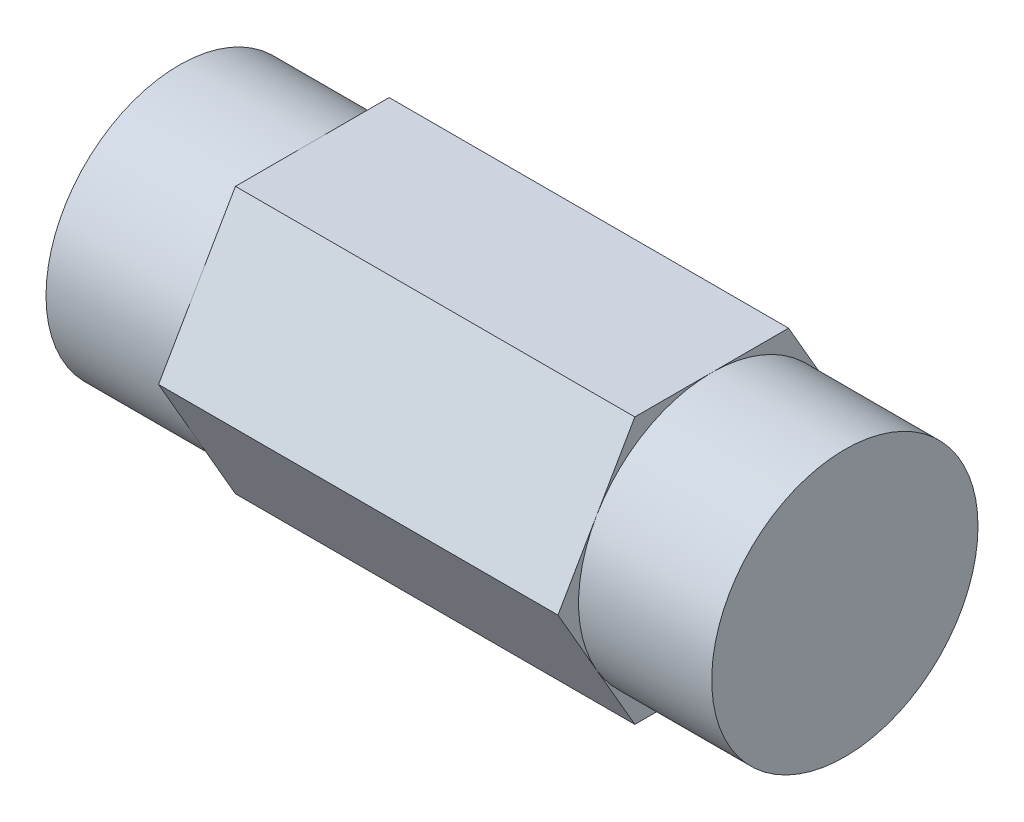
ISO-10303-21;
HEADER;
FILE_DESCRIPTION(('STEP AP214'),'2;1');
FILE_NAME('part.step','',(''),(''),'','','');
FILE_SCHEMA(('AUTOMOTIVE_DESIGN { 1 0 10303 214 1 1 1 1 }'));
ENDSEC;
DATA;
#1=APPLICATION_CONTEXT('core data for automotive mechanical design processes');
#2=APPLICATION_PROTOCOL_DEFINITION('international standard','automotive_design',2000,#1);
#3=PRODUCT_CONTEXT('',#1,'mechanical');
#4=PRODUCT('Part','Part','',(#3));
#5=PRODUCT_RELATED_PRODUCT_CATEGORY('part','',(#4));
#6=PRODUCT_DEFINITION_FORMATION('','',#4);
#7=PRODUCT_DEFINITION_CONTEXT('part definition',#1,'design');
#8=PRODUCT_DEFINITION('design','',#6,#7);
#9=PRODUCT_DEFINITION_SHAPE('','',#8);
#10=(LENGTH_UNIT() NAMED_UNIT(*) SI_UNIT(.MILLI.,.METRE.));
#11=(NAMED_UNIT(*) PLANE_ANGLE_UNIT() SI_UNIT($,.RADIAN.));
#12=(NAMED_UNIT(*) SI_UNIT($,.STERADIAN.) SOLID_ANGLE_UNIT());
#13=UNCERTAINTY_MEASURE_WITH_UNIT(LENGTH_MEASURE(1.E-05),#10,'distance_accuracy_value','');
#14=(GEOMETRIC_REPRESENTATION_CONTEXT(3) GLOBAL_UNCERTAINTY_ASSIGNED_CONTEXT((#13)) GLOBAL_UNIT_ASSIGNED_CONTEXT((#10,
#11,#12)) REPRESENTATION_CONTEXT('',''));
#15=CARTESIAN_POINT('',(0.,0.,0.));
#16=DIRECTION('',(0.,0.,1.));
#17=DIRECTION('',(1.,0.,0.));
#18=AXIS2_PLACEMENT_3D('',#15,#16,#17);
#19=CARTESIAN_POINT('',(0.,0.,0.));
#20=DIRECTION('',(1.,0.,0.));
#21=DIRECTION('',(0.,0.,-1.));
#22=AXIS2_PLACEMENT_3D('',#19,#20,#21);
#23=PLANE('',#22);
#24=CARTESIAN_POINT('',(0.,0.,0.));
#25=DIRECTION('',(-1.,0.,0.));
#26=DIRECTION('',(0.,0.,1.));
#27=AXIS2_PLACEMENT_3D('',#24,#25,#26);
#28=CIRCLE('',#27,6.35);
#29=CARTESIAN_POINT('',(0.,3.175,5.49926131403119));
#30=VERTEX_POINT('',#29);
#31=CARTESIAN_POINT('',(0.,6.35,0.));
#32=VERTEX_POINT('',#31);
#33=EDGE_CURVE('E46',#30,#32,#28,.T.);
#34=ORIENTED_EDGE('',*,*,#33,.F.);
#35=DIRECTION('',(0.,-0.866025403784439,0.5));
#36=VECTOR('',#35,1.);
#37=CARTESIAN_POINT('',(0.,6.35,3.66617420935412));
#38=LINE('',#37,#36);
#39=CARTESIAN_POINT('',(0.,6.35,3.66617420935412));
#40=VERTEX_POINT('',#39);
#41=EDGE_CURVE('E130',#40,#30,#38,.T.);
#42=ORIENTED_EDGE('',*,*,#41,.F.);
#43=DIRECTION('',(0.,0.,1.));
#44=VECTOR('',#43,1.);
#45=CARTESIAN_POINT('',(0.,6.35,-3.66617420935412));
#46=LINE('',#45,#44);
#47=EDGE_CURVE('E153',#32,#40,#46,.T.);
#48=ORIENTED_EDGE('',*,*,#47,.F.);
#49=EDGE_LOOP('',(#34,#42,#48));
#50=FACE_BOUND('',#49,.T.);
#51=ADVANCED_FACE('F35',(#50),#23,.F.);
#52=CARTESIAN_POINT('',(0.,3.175,-5.49926131403118));
#53=VERTEX_POINT('',#52);
#54=EDGE_CURVE('E11',#32,#53,#28,.T.);
#55=ORIENTED_EDGE('',*,*,#54,.F.);
#56=CARTESIAN_POINT('',(0.,6.35,-3.66617420935412));
#57=VERTEX_POINT('',#56);
#58=EDGE_CURVE('E151',#57,#32,#46,.T.);
#59=ORIENTED_EDGE('',*,*,#58,.F.);
#60=DIRECTION('',(0.,0.866025403784439,0.5));
#61=VECTOR('',#60,1.);
#62=CARTESIAN_POINT('',(0.,0.,-7.33234841870824));
#63=LINE('',#62,#61);
#64=EDGE_CURVE('E203',#53,#57,#63,.T.);
#65=ORIENTED_EDGE('',*,*,#64,.F.);
#66=EDGE_LOOP('',(#55,#59,#65));
#67=FACE_BOUND('',#66,.T.);
#68=ADVANCED_FACE('F246',(#67),#23,.F.);
#69=CARTESIAN_POINT('',(0.,-3.175,-5.49926131403118));
#70=VERTEX_POINT('',#69);
#71=EDGE_CURVE('E44',#53,#70,#28,.T.);
#72=ORIENTED_EDGE('',*,*,#71,.F.);
#73=CARTESIAN_POINT('',(0.,0.,-7.33234841870824));
#74=VERTEX_POINT('',#73);
#75=EDGE_CURVE('E204',#74,#53,#63,.T.);
#76=ORIENTED_EDGE('',*,*,#75,.F.);
#77=DIRECTION('',(0.,0.866025403784439,-0.5));
#78=VECTOR('',#77,1.);
#79=CARTESIAN_POINT('',(0.,-6.35,-3.66617420935412));
#80=LINE('',#79,#78);
#81=EDGE_CURVE('E199',#70,#74,#80,.T.);
#82=ORIENTED_EDGE('',*,*,#81,.F.);
#83=EDGE_LOOP('',(#72,#76,#82));
#84=FACE_BOUND('',#83,.T.);
#85=ADVANCED_FACE('F250',(#84),#23,.F.);
#86=CARTESIAN_POINT('',(0.,-6.35,0.));
#87=VERTEX_POINT('',#86);
#88=EDGE_CURVE('E60',#70,#87,#28,.T.);
#89=ORIENTED_EDGE('',*,*,#88,.F.);
#90=CARTESIAN_POINT('',(0.,-6.35,-3.66617420935412));
#91=VERTEX_POINT('',#90);
#92=EDGE_CURVE('E200',#91,#70,#80,.T.);
#93=ORIENTED_EDGE('',*,*,#92,.F.);
#94=DIRECTION('',(0.,0.,-1.));
#95=VECTOR('',#94,1.);
#96=CARTESIAN_POINT('',(0.,-6.35,3.66617420935412));
#97=LINE('',#96,#95);
#98=EDGE_CURVE('E195',#87,#91,#97,.T.);
#99=ORIENTED_EDGE('',*,*,#98,.F.);
#100=EDGE_LOOP('',(#89,#93,#99));
#101=FACE_BOUND('',#100,.T.);
#102=ADVANCED_FACE('F253',(#101),#23,.F.);
#103=CARTESIAN_POINT('',(0.,-3.175,5.49926131403118));
#104=VERTEX_POINT('',#103);
#105=EDGE_CURVE('E53',#87,#104,#28,.T.);
#106=ORIENTED_EDGE('',*,*,#105,.F.);
#107=CARTESIAN_POINT('',(0.,-6.35,3.66617420935412));
#108=VERTEX_POINT('',#107);
#109=EDGE_CURVE('E196',#108,#87,#97,.T.);
#110=ORIENTED_EDGE('',*,*,#109,.F.);
#111=DIRECTION('',(0.,-0.866025403784439,-0.5));
#112=VECTOR('',#111,1.);
#113=CARTESIAN_POINT('',(0.,0.,7.33234841870824));
#114=LINE('',#113,#112);
#115=EDGE_CURVE('E167',#104,#108,#114,.T.);
#116=ORIENTED_EDGE('',*,*,#115,.F.);
#117=EDGE_LOOP('',(#106,#110,#116));
#118=FACE_BOUND('',#117,.T.);
#119=ADVANCED_FACE('F255',(#118),#23,.F.);
#120=CARTESIAN_POINT('',(19.05,0.,0.));
#121=DIRECTION('',(1.,0.,0.));
#122=DIRECTION('',(0.,0.,-1.));
#123=AXIS2_PLACEMENT_3D('',#120,#121,#122);
#124=PLANE('',#123);
#125=CARTESIAN_POINT('',(19.05,0.,0.));
#126=DIRECTION('',(1.,0.,0.));
#127=DIRECTION('',(0.,0.,-1.));
#128=AXIS2_PLACEMENT_3D('',#125,#126,#127);
#129=CIRCLE('',#128,6.35);
#130=CARTESIAN_POINT('',(19.05,3.175,-5.49926131403118));
#131=VERTEX_POINT('',#130);
#132=CARTESIAN_POINT('',(19.05,6.35,0.));
#133=VERTEX_POINT('',#132);
#134=EDGE_CURVE('E162',#131,#133,#129,.T.);
#135=ORIENTED_EDGE('',*,*,#134,.F.);
#136=DIRECTION('',(0.,0.866025403784439,0.5));
#137=VECTOR('',#136,1.);
#138=CARTESIAN_POINT('',(19.05,0.,-7.33234841870824));
#139=LINE('',#138,#137);
#140=CARTESIAN_POINT('',(19.05,6.35,-3.66617420935412));
#141=VERTEX_POINT('',#140);
#142=EDGE_CURVE('E182',#131,#141,#139,.T.);
#143=ORIENTED_EDGE('',*,*,#142,.T.);
#144=DIRECTION('',(0.,0.,1.));
#145=VECTOR('',#144,1.);
#146=CARTESIAN_POINT('',(19.05,6.35,-3.66617420935412));
#147=LINE('',#146,#145);
#148=EDGE_CURVE('E186',#141,#133,#147,.T.);
#149=ORIENTED_EDGE('',*,*,#148,.T.);
#150=EDGE_LOOP('',(#135,#143,#149));
#151=FACE_BOUND('',#150,.T.);
#152=ADVANCED_FACE('F272',(#151),#124,.T.);
#153=CARTESIAN_POINT('',(19.05,3.175,5.49926131403119));
#154=VERTEX_POINT('',#153);
#155=EDGE_CURVE('E158',#133,#154,#129,.T.);
#156=ORIENTED_EDGE('',*,*,#155,.F.);
#157=CARTESIAN_POINT('',(19.05,6.35,3.66617420935412));
#158=VERTEX_POINT('',#157);
#159=EDGE_CURVE('E185',#133,#158,#147,.T.);
#160=ORIENTED_EDGE('',*,*,#159,.T.);
#161=DIRECTION('',(0.,-0.866025403784439,0.5));
#162=VECTOR('',#161,1.);
#163=CARTESIAN_POINT('',(19.05,6.35,3.66617420935412));
#164=LINE('',#163,#162);
#165=EDGE_CURVE('E190',#158,#154,#164,.T.);
#166=ORIENTED_EDGE('',*,*,#165,.T.);
#167=EDGE_LOOP('',(#156,#160,#166));
#168=FACE_BOUND('',#167,.T.);
#169=ADVANCED_FACE('F237',(#168),#124,.T.);
#170=CARTESIAN_POINT('',(19.05,-3.175,5.49926131403118));
#171=VERTEX_POINT('',#170);
#172=EDGE_CURVE('E160',#154,#171,#129,.T.);
#173=ORIENTED_EDGE('',*,*,#172,.F.);
#174=CARTESIAN_POINT('',(19.05,0.,7.33234841870824));
#175=VERTEX_POINT('',#174);
#176=EDGE_CURVE('E189',#154,#175,#164,.T.);
#177=ORIENTED_EDGE('',*,*,#176,.T.);
#178=DIRECTION('',(0.,-0.866025403784439,-0.5));
#179=VECTOR('',#178,1.);
#180=CARTESIAN_POINT('',(19.05,0.,7.33234841870824));
#181=LINE('',#180,#179);
#182=EDGE_CURVE('E171',#175,#171,#181,.T.);
#183=ORIENTED_EDGE('',*,*,#182,.T.);
#184=EDGE_LOOP('',(#173,#177,#183));
#185=FACE_BOUND('',#184,.T.);
#186=ADVANCED_FACE('F234',(#185),#124,.T.);
#187=CARTESIAN_POINT('',(19.05,-6.35,0.));
#188=VERTEX_POINT('',#187);
#189=EDGE_CURVE('E228',#171,#188,#129,.T.);
#190=ORIENTED_EDGE('',*,*,#189,.F.);
#191=CARTESIAN_POINT('',(19.05,-6.35,3.66617420935412));
#192=VERTEX_POINT('',#191);
#193=EDGE_CURVE('E142',#171,#192,#181,.T.);
#194=ORIENTED_EDGE('',*,*,#193,.T.);
#195=DIRECTION('',(0.,0.,-1.));
#196=VECTOR('',#195,1.);
#197=CARTESIAN_POINT('',(19.05,-6.35,3.66617420935412));
#198=LINE('',#197,#196);
#199=EDGE_CURVE('E175',#192,#188,#198,.T.);
#200=ORIENTED_EDGE('',*,*,#199,.T.);
#201=EDGE_LOOP('',(#190,#194,#200));
#202=FACE_BOUND('',#201,.T.);
#203=ADVANCED_FACE('F259',(#202),#124,.T.);
#204=CARTESIAN_POINT('',(19.05,-3.175,-5.49926131403118));
#205=VERTEX_POINT('',#204);
#206=EDGE_CURVE('E225',#188,#205,#129,.T.);
#207=ORIENTED_EDGE('',*,*,#206,.F.);
#208=CARTESIAN_POINT('',(19.05,-6.35,-3.66617420935412));
#209=VERTEX_POINT('',#208);
#210=EDGE_CURVE('E174',#188,#209,#198,.T.);
#211=ORIENTED_EDGE('',*,*,#210,.T.);
#212=DIRECTION('',(0.,0.866025403784439,-0.5));
#213=VECTOR('',#212,1.);
#214=CARTESIAN_POINT('',(19.05,-6.35,-3.66617420935412));
#215=LINE('',#214,#213);
#216=EDGE_CURVE('E179',#209,#205,#215,.T.);
#217=ORIENTED_EDGE('',*,*,#216,.T.);
#218=EDGE_LOOP('',(#207,#211,#217));
#219=FACE_BOUND('',#218,.T.);
#220=ADVANCED_FACE('F262',(#219),#124,.T.);
#221=CARTESIAN_POINT('',(19.05,0.,7.33234841870824));
#222=DIRECTION('',(0.,0.5,-0.866025403784439));
#223=DIRECTION('',(0.,0.866025403784439,0.5));
#224=AXIS2_PLACEMENT_3D('',#221,#222,#223);
#225=PLANE('',#224);
#226=CARTESIAN_POINT('',(0.,0.,7.33234841870824));
#227=VERTEX_POINT('',#226);
#228=EDGE_CURVE('E150',#227,#104,#114,.T.);
#229=ORIENTED_EDGE('',*,*,#228,.T.);
#230=ORIENTED_EDGE('',*,*,#115,.T.);
#231=DIRECTION('',(-1.,0.,0.));
#232=VECTOR('',#231,1.);
#233=CARTESIAN_POINT('',(19.05,-6.35,3.66617420935412));
#234=LINE('',#233,#232);
#235=EDGE_CURVE('E39',#192,#108,#234,.T.);
#236=ORIENTED_EDGE('',*,*,#235,.F.);
#237=ORIENTED_EDGE('',*,*,#193,.F.);
#238=ORIENTED_EDGE('',*,*,#182,.F.);
#239=DIRECTION('',(-1.,0.,0.));
#240=VECTOR('',#239,1.);
#241=CARTESIAN_POINT('',(19.05,0.,7.33234841870824));
#242=LINE('',#241,#240);
#243=EDGE_CURVE('E193',#175,#227,#242,.T.);
#244=ORIENTED_EDGE('',*,*,#243,.T.);
#245=EDGE_LOOP('',(#229,#230,#236,#237,#238,#244));
#246=FACE_BOUND('',#245,.T.);
#247=ADVANCED_FACE('F37',(#246),#225,.F.);
#248=CARTESIAN_POINT('',(19.05,-6.35,3.66617420935412));
#249=DIRECTION('',(0.,1.,0.));
#250=DIRECTION('',(0.,0.,1.));
#251=AXIS2_PLACEMENT_3D('',#248,#249,#250);
#252=PLANE('',#251);
#253=ORIENTED_EDGE('',*,*,#109,.T.);
#254=ORIENTED_EDGE('',*,*,#98,.T.);
#255=DIRECTION('',(-1.,0.,0.));
#256=VECTOR('',#255,1.);
#257=CARTESIAN_POINT('',(19.05,-6.35,-3.66617420935412));
#258=LINE('',#257,#256);
#259=EDGE_CURVE('E215',#209,#91,#258,.T.);
#260=ORIENTED_EDGE('',*,*,#259,.F.);
#261=ORIENTED_EDGE('',*,*,#210,.F.);
#262=ORIENTED_EDGE('',*,*,#199,.F.);
#263=ORIENTED_EDGE('',*,*,#235,.T.);
#264=EDGE_LOOP('',(#253,#254,#260,#261,#262,#263));
#265=FACE_BOUND('',#264,.T.);
#266=ADVANCED_FACE('F254',(#265),#252,.F.);
#267=CARTESIAN_POINT('',(19.05,-6.35,-3.66617420935412));
#268=DIRECTION('',(0.,0.5,0.866025403784439));
#269=DIRECTION('',(0.,-0.866025403784439,0.5));
#270=AXIS2_PLACEMENT_3D('',#267,#268,#269);
#271=PLANE('',#270);
#272=ORIENTED_EDGE('',*,*,#92,.T.);
#273=ORIENTED_EDGE('',*,*,#81,.T.);
#274=DIRECTION('',(-1.,0.,0.));
#275=VECTOR('',#274,1.);
#276=CARTESIAN_POINT('',(19.05,0.,-7.33234841870824));
#277=LINE('',#276,#275);
#278=CARTESIAN_POINT('',(19.05,0.,-7.33234841870824));
#279=VERTEX_POINT('',#278);
#280=EDGE_CURVE('E213',#279,#74,#277,.T.);
#281=ORIENTED_EDGE('',*,*,#280,.F.);
#282=EDGE_CURVE('E178',#205,#279,#215,.T.);
#283=ORIENTED_EDGE('',*,*,#282,.F.);
#284=ORIENTED_EDGE('',*,*,#216,.F.);
#285=ORIENTED_EDGE('',*,*,#259,.T.);
#286=EDGE_LOOP('',(#272,#273,#281,#283,#284,#285));
#287=FACE_BOUND('',#286,.T.);
#288=ADVANCED_FACE('F252',(#287),#271,.F.);
#289=CARTESIAN_POINT('',(19.05,0.,-7.33234841870824));
#290=DIRECTION('',(0.,-0.5,0.866025403784439));
#291=DIRECTION('',(0.,-0.866025403784438,-0.5));
#292=AXIS2_PLACEMENT_3D('',#289,#290,#291);
#293=PLANE('',#292);
#294=ORIENTED_EDGE('',*,*,#75,.T.);
#295=ORIENTED_EDGE('',*,*,#64,.T.);
#296=DIRECTION('',(-1.,0.,0.));
#297=VECTOR('',#296,1.);
#298=CARTESIAN_POINT('',(19.05,6.35,-3.66617420935412));
#299=LINE('',#298,#297);
#300=EDGE_CURVE('E210',#141,#57,#299,.T.);
#301=ORIENTED_EDGE('',*,*,#300,.F.);
#302=ORIENTED_EDGE('',*,*,#142,.F.);
#303=EDGE_CURVE('E183',#279,#131,#139,.T.);
#304=ORIENTED_EDGE('',*,*,#303,.F.);
#305=ORIENTED_EDGE('',*,*,#280,.T.);
#306=EDGE_LOOP('',(#294,#295,#301,#302,#304,#305));
#307=FACE_BOUND('',#306,.T.);
#308=ADVANCED_FACE('F270',(#307),#293,.F.);
#309=CARTESIAN_POINT('',(19.05,6.35,-3.66617420935412));
#310=DIRECTION('',(0.,-1.,0.));
#311=DIRECTION('',(0.,0.,-1.));
#312=AXIS2_PLACEMENT_3D('',#309,#310,#311);
#313=PLANE('',#312);
#314=ORIENTED_EDGE('',*,*,#58,.T.);
#315=ORIENTED_EDGE('',*,*,#47,.T.);
#316=DIRECTION('',(-1.,0.,0.));
#317=VECTOR('',#316,1.);
#318=CARTESIAN_POINT('',(19.05,6.35,3.66617420935412));
#319=LINE('',#318,#317);
#320=EDGE_CURVE('E138',#158,#40,#319,.T.);
#321=ORIENTED_EDGE('',*,*,#320,.F.);
#322=ORIENTED_EDGE('',*,*,#159,.F.);
#323=ORIENTED_EDGE('',*,*,#148,.F.);
#324=ORIENTED_EDGE('',*,*,#300,.T.);
#325=EDGE_LOOP('',(#314,#315,#321,#322,#323,#324));
#326=FACE_BOUND('',#325,.T.);
#327=ADVANCED_FACE('F241',(#326),#313,.F.);
#328=CARTESIAN_POINT('',(19.05,6.35,3.66617420935412));
#329=DIRECTION('',(0.,-0.5,-0.866025403784439));
#330=DIRECTION('',(0.,0.866025403784439,-0.5));
#331=AXIS2_PLACEMENT_3D('',#328,#329,#330);
#332=PLANE('',#331);
#333=ORIENTED_EDGE('',*,*,#41,.T.);
#334=EDGE_CURVE('E134',#30,#227,#38,.T.);
#335=ORIENTED_EDGE('',*,*,#334,.T.);
#336=ORIENTED_EDGE('',*,*,#243,.F.);
#337=ORIENTED_EDGE('',*,*,#176,.F.);
#338=ORIENTED_EDGE('',*,*,#165,.F.);
#339=ORIENTED_EDGE('',*,*,#320,.T.);
#340=EDGE_LOOP('',(#333,#335,#336,#337,#338,#339));
#341=FACE_BOUND('',#340,.T.);
#342=ADVANCED_FACE('F132',(#341),#332,.F.);
#343=EDGE_CURVE('E170',#205,#131,#129,.T.);
#344=ORIENTED_EDGE('',*,*,#343,.F.);
#345=ORIENTED_EDGE('',*,*,#282,.T.);
#346=ORIENTED_EDGE('',*,*,#303,.T.);
#347=EDGE_LOOP('',(#344,#345,#346));
#348=FACE_BOUND('',#347,.T.);
#349=ADVANCED_FACE('F266',(#348),#124,.T.);
#350=EDGE_CURVE('E148',#104,#30,#28,.T.);
#351=ORIENTED_EDGE('',*,*,#350,.F.);
#352=ORIENTED_EDGE('',*,*,#228,.F.);
#353=ORIENTED_EDGE('',*,*,#334,.F.);
#354=EDGE_LOOP('',(#351,#352,#353));
#355=FACE_BOUND('',#354,.T.);
#356=ADVANCED_FACE('F146',(#355),#23,.F.);
#357=CARTESIAN_POINT('',(25.4,0.,0.));
#358=DIRECTION('',(-1.,0.,0.));
#359=DIRECTION('',(0.,0.,1.));
#360=AXIS2_PLACEMENT_3D('',#357,#358,#359);
#361=CYLINDRICAL_SURFACE('',#360,6.35);
#362=CARTESIAN_POINT('',(25.4,0.,0.));
#363=DIRECTION('',(1.,0.,0.));
#364=DIRECTION('',(0.,0.,-1.));
#365=AXIS2_PLACEMENT_3D('',#362,#363,#364);
#366=CIRCLE('',#365,6.35);
#367=CARTESIAN_POINT('',(25.4,0.,-6.35));
#368=VERTEX_POINT('',#367);
#369=EDGE_CURVE('E165',#368,#368,#366,.T.);
#370=ORIENTED_EDGE('',*,*,#369,.F.);
#371=EDGE_LOOP('',(#370));
#372=FACE_BOUND('',#371,.T.);
#373=ORIENTED_EDGE('',*,*,#134,.T.);
#374=ORIENTED_EDGE('',*,*,#155,.T.);
#375=ORIENTED_EDGE('',*,*,#172,.T.);
#376=ORIENTED_EDGE('',*,*,#189,.T.);
#377=ORIENTED_EDGE('',*,*,#206,.T.);
#378=ORIENTED_EDGE('',*,*,#343,.T.);
#379=EDGE_LOOP('',(#373,#374,#375,#376,#377,#378));
#380=FACE_BOUND('',#379,.T.);
#381=ADVANCED_FACE('F231',(#372,#380),#361,.T.);
#382=CARTESIAN_POINT('',(25.4,0.,0.));
#383=DIRECTION('',(1.,0.,0.));
#384=DIRECTION('',(0.,0.,-1.));
#385=AXIS2_PLACEMENT_3D('',#382,#383,#384);
#386=PLANE('',#385);
#387=ORIENTED_EDGE('',*,*,#369,.T.);
#388=EDGE_LOOP('',(#387));
#389=FACE_BOUND('',#388,.T.);
#390=ADVANCED_FACE('F291',(#389),#386,.T.);
#391=CARTESIAN_POINT('',(-6.35,0.,0.));
#392=DIRECTION('',(1.,0.,0.));
#393=DIRECTION('',(0.,0.,-1.));
#394=AXIS2_PLACEMENT_3D('',#391,#392,#393);
#395=CYLINDRICAL_SURFACE('',#394,6.35);
#396=CARTESIAN_POINT('',(-6.35,0.,0.));
#397=DIRECTION('',(-1.,0.,0.));
#398=DIRECTION('',(0.,0.,1.));
#399=AXIS2_PLACEMENT_3D('',#396,#397,#398);
#400=CIRCLE('',#399,6.35);
#401=CARTESIAN_POINT('',(-6.35,0.,6.35));
#402=VERTEX_POINT('',#401);
#403=EDGE_CURVE('E156',#402,#402,#400,.T.);
#404=ORIENTED_EDGE('',*,*,#403,.F.);
#405=EDGE_LOOP('',(#404));
#406=FACE_BOUND('',#405,.T.);
#407=ORIENTED_EDGE('',*,*,#33,.T.);
#408=ORIENTED_EDGE('',*,*,#54,.T.);
#409=ORIENTED_EDGE('',*,*,#71,.T.);
#410=ORIENTED_EDGE('',*,*,#88,.T.);
#411=ORIENTED_EDGE('',*,*,#105,.T.);
#412=ORIENTED_EDGE('',*,*,#350,.T.);
#413=EDGE_LOOP('',(#407,#408,#409,#410,#411,#412));
#414=FACE_BOUND('',#413,.T.);
#415=ADVANCED_FACE('F157',(#406,#414),#395,.T.);
#416=CARTESIAN_POINT('',(-6.35,0.,0.));
#417=DIRECTION('',(-1.,0.,0.));
#418=DIRECTION('',(0.,0.,1.));
#419=AXIS2_PLACEMENT_3D('',#416,#417,#418);
#420=PLANE('',#419);
#421=ORIENTED_EDGE('',*,*,#403,.T.);
#422=EDGE_LOOP('',(#421));
#423=FACE_BOUND('',#422,.T.);
#424=ADVANCED_FACE('F302',(#423),#420,.T.);
#425=CLOSED_SHELL('',(#51,#68,#85,#102,#119,#152,#169,#186,#203,#220,#247,#266,#288,#308,#327,
#342,#349,#356,#381,#390,#415,#424));
#426=MANIFOLD_SOLID_BREP('B2',#425);
#427=ADVANCED_BREP_SHAPE_REPRESENTATION('',(#18,#426),#14);
#428=SHAPE_DEFINITION_REPRESENTATION(#9,#427);
ENDSEC;
END-ISO-10303-21;
